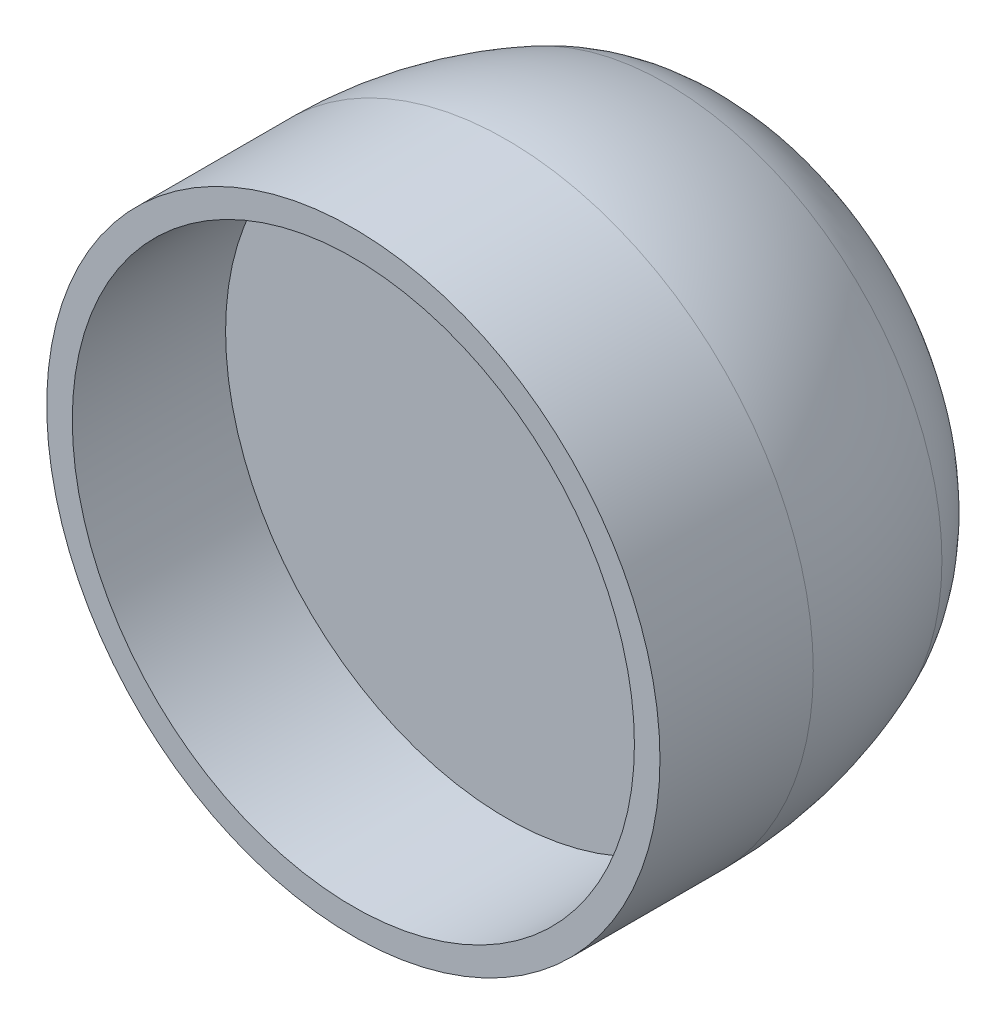
ISO-10303-21;
HEADER;
FILE_DESCRIPTION(('STEP AP214'),'2;1');
FILE_NAME('part.step','',(''),(''),'','','');
FILE_SCHEMA(('AUTOMOTIVE_DESIGN { 1 0 10303 214 1 1 1 1 }'));
ENDSEC;
DATA;
#1=APPLICATION_CONTEXT('core data for automotive mechanical design processes');
#2=APPLICATION_PROTOCOL_DEFINITION('international standard','automotive_design',2000,#1);
#3=PRODUCT_CONTEXT('',#1,'mechanical');
#4=PRODUCT('Part','Part','',(#3));
#5=PRODUCT_RELATED_PRODUCT_CATEGORY('part','',(#4));
#6=PRODUCT_DEFINITION_FORMATION('','',#4);
#7=PRODUCT_DEFINITION_CONTEXT('part definition',#1,'design');
#8=PRODUCT_DEFINITION('design','',#6,#7);
#9=PRODUCT_DEFINITION_SHAPE('','',#8);
#10=(LENGTH_UNIT() NAMED_UNIT(*) SI_UNIT(.MILLI.,.METRE.));
#11=(NAMED_UNIT(*) PLANE_ANGLE_UNIT() SI_UNIT($,.RADIAN.));
#12=(NAMED_UNIT(*) SI_UNIT($,.STERADIAN.) SOLID_ANGLE_UNIT());
#13=UNCERTAINTY_MEASURE_WITH_UNIT(LENGTH_MEASURE(1.E-05),#10,'distance_accuracy_value','');
#14=(GEOMETRIC_REPRESENTATION_CONTEXT(3) GLOBAL_UNCERTAINTY_ASSIGNED_CONTEXT((#13)) GLOBAL_UNIT_ASSIGNED_CONTEXT((#10,
#11,#12)) REPRESENTATION_CONTEXT('',''));
#15=CARTESIAN_POINT('',(0.,0.,0.));
#16=DIRECTION('',(0.,0.,1.));
#17=DIRECTION('',(1.,0.,0.));
#18=AXIS2_PLACEMENT_3D('',#15,#16,#17);
#19=CARTESIAN_POINT('',(5.5,0.,0.));
#20=DIRECTION('',(0.,0.,1.));
#21=DIRECTION('',(1.,0.,0.));
#22=AXIS2_PLACEMENT_3D('',#19,#20,#21);
#23=PLANE('',#22);
#24=CARTESIAN_POINT('',(0.,0.,0.));
#25=DIRECTION('',(0.,0.,1.));
#26=DIRECTION('',(1.,0.,0.));
#27=AXIS2_PLACEMENT_3D('',#24,#25,#26);
#28=CIRCLE('',#27,5.5);
#29=CARTESIAN_POINT('',(5.5,0.,0.));
#30=VERTEX_POINT('',#29);
#31=EDGE_CURVE('E40',#30,#30,#28,.T.);
#32=ORIENTED_EDGE('',*,*,#31,.T.);
#33=EDGE_LOOP('',(#32));
#34=FACE_BOUND('',#33,.T.);
#35=ADVANCED_FACE('F29',(#34),#23,.T.);
#36=CARTESIAN_POINT('',(0.,0.,0.));
#37=DIRECTION('',(0.,0.,1.));
#38=DIRECTION('',(1.,0.,0.));
#39=AXIS2_PLACEMENT_3D('',#36,#37,#38);
#40=CYLINDRICAL_SURFACE('',#39,5.5);
#41=CARTESIAN_POINT('',(0.,0.,3.));
#42=DIRECTION('',(0.,0.,1.));
#43=DIRECTION('',(1.,0.,0.));
#44=AXIS2_PLACEMENT_3D('',#41,#42,#43);
#45=CIRCLE('',#44,5.5);
#46=CARTESIAN_POINT('',(5.5,0.,3.));
#47=VERTEX_POINT('',#46);
#48=EDGE_CURVE('E44',#47,#47,#45,.T.);
#49=ORIENTED_EDGE('',*,*,#48,.T.);
#50=EDGE_LOOP('',(#49));
#51=FACE_BOUND('',#50,.T.);
#52=ORIENTED_EDGE('',*,*,#31,.F.);
#53=EDGE_LOOP('',(#52));
#54=FACE_BOUND('',#53,.T.);
#55=ADVANCED_FACE('F71',(#51,#54),#40,.F.);
#56=CARTESIAN_POINT('',(6.,0.,3.));
#57=DIRECTION('',(0.,0.,1.));
#58=DIRECTION('',(1.,0.,0.));
#59=AXIS2_PLACEMENT_3D('',#56,#57,#58);
#60=PLANE('',#59);
#61=CARTESIAN_POINT('',(0.,0.,3.));
#62=DIRECTION('',(0.,0.,1.));
#63=DIRECTION('',(1.,0.,0.));
#64=AXIS2_PLACEMENT_3D('',#61,#62,#63);
#65=CIRCLE('',#64,6.);
#66=CARTESIAN_POINT('',(6.,0.,3.));
#67=VERTEX_POINT('',#66);
#68=EDGE_CURVE('E49',#67,#67,#65,.T.);
#69=ORIENTED_EDGE('',*,*,#68,.T.);
#70=EDGE_LOOP('',(#69));
#71=FACE_BOUND('',#70,.T.);
#72=ORIENTED_EDGE('',*,*,#48,.F.);
#73=EDGE_LOOP('',(#72));
#74=FACE_BOUND('',#73,.T.);
#75=ADVANCED_FACE('F68',(#71,#74),#60,.T.);
#76=CARTESIAN_POINT('',(0.,0.,0.));
#77=DIRECTION('',(0.,0.,1.));
#78=DIRECTION('',(1.,0.,0.));
#79=AXIS2_PLACEMENT_3D('',#76,#77,#78);
#80=CYLINDRICAL_SURFACE('',#79,6.);
#81=CARTESIAN_POINT('',(0.,0.,0.));
#82=DIRECTION('',(0.,0.,1.));
#83=DIRECTION('',(1.,0.,0.));
#84=AXIS2_PLACEMENT_3D('',#81,#82,#83);
#85=CIRCLE('',#84,6.);
#86=CARTESIAN_POINT('',(6.,0.,0.));
#87=VERTEX_POINT('',#86);
#88=EDGE_CURVE('E52',#87,#87,#85,.T.);
#89=ORIENTED_EDGE('',*,*,#88,.T.);
#90=EDGE_LOOP('',(#89));
#91=FACE_BOUND('',#90,.T.);
#92=ORIENTED_EDGE('',*,*,#68,.F.);
#93=EDGE_LOOP('',(#92));
#94=FACE_BOUND('',#93,.T.);
#95=ADVANCED_FACE('F56',(#91,#94),#80,.T.);
#96=CARTESIAN_POINT('',(0.,0.,0.));
#97=DIRECTION('',(0.,0.,1.));
#98=DIRECTION('',(1.,0.,0.));
#99=AXIS2_PLACEMENT_3D('',#96,#97,#98);
#100=DEGENERATE_TOROIDAL_SURFACE('',#99,2.33333333333333,8.33333333333334,.F.);
#101=CARTESIAN_POINT('',(0.,0.,-3.125));
#102=DIRECTION('',(0.,0.,1.));
#103=DIRECTION('',(1.,0.,0.));
#104=AXIS2_PLACEMENT_3D('',#101,#102,#103);
#105=CIRCLE('',#104,5.39187342405798);
#106=CARTESIAN_POINT('',(5.39187342405798,0.,-3.125));
#107=VERTEX_POINT('',#106);
#108=EDGE_CURVE('E11',#107,#107,#105,.T.);
#109=ORIENTED_EDGE('',*,*,#108,.T.);
#110=EDGE_LOOP('',(#109));
#111=FACE_BOUND('',#110,.T.);
#112=ORIENTED_EDGE('',*,*,#88,.F.);
#113=EDGE_LOOP('',(#112));
#114=FACE_BOUND('',#113,.T.);
#115=ADVANCED_FACE('F59',(#111,#114),#100,.F.);
#116=CARTESIAN_POINT('',(0.,-24.2835569799683,-5.));
#117=DIRECTION('',(0.,0.,1.));
#118=DIRECTION('',(1.,0.,0.));
#119=AXIS2_PLACEMENT_3D('',#116,#117,#118);
#120=PLANE('',#119);
#121=CARTESIAN_POINT('',(0.,0.,-5.));
#122=DIRECTION('',(0.,0.,1.));
#123=DIRECTION('',(1.,0.,0.));
#124=AXIS2_PLACEMENT_3D('',#121,#122,#123);
#125=CIRCLE('',#124,2.61079899139711);
#126=CARTESIAN_POINT('',(2.61079899139711,0.,-5.));
#127=VERTEX_POINT('',#126);
#128=EDGE_CURVE('E36',#127,#127,#125,.F.);
#129=ORIENTED_EDGE('',*,*,#128,.T.);
#130=EDGE_LOOP('',(#129));
#131=FACE_BOUND('',#130,.T.);
#132=ADVANCED_FACE('F61',(#131),#120,.F.);
#133=CARTESIAN_POINT('',(0.,0.,-2.));
#134=DIRECTION('',(0.,0.,1.));
#135=DIRECTION('',(1.,0.,0.));
#136=AXIS2_PLACEMENT_3D('',#133,#134,#135);
#137=DEGENERATE_TOROIDAL_SURFACE('',#136,2.61079899139711,3.,.T.);
#138=ORIENTED_EDGE('',*,*,#108,.F.);
#139=EDGE_LOOP('',(#138));
#140=FACE_BOUND('',#139,.T.);
#141=ORIENTED_EDGE('',*,*,#128,.F.);
#142=EDGE_LOOP('',(#141));
#143=FACE_BOUND('',#142,.T.);
#144=ADVANCED_FACE('F31',(#140,#143),#137,.T.);
#145=CLOSED_SHELL('',(#35,#55,#75,#95,#115,#132,#144));
#146=MANIFOLD_SOLID_BREP('B2',#145);
#147=ADVANCED_BREP_SHAPE_REPRESENTATION('',(#18,#146),#14);
#148=SHAPE_DEFINITION_REPRESENTATION(#9,#147);
ENDSEC;
END-ISO-10303-21;
